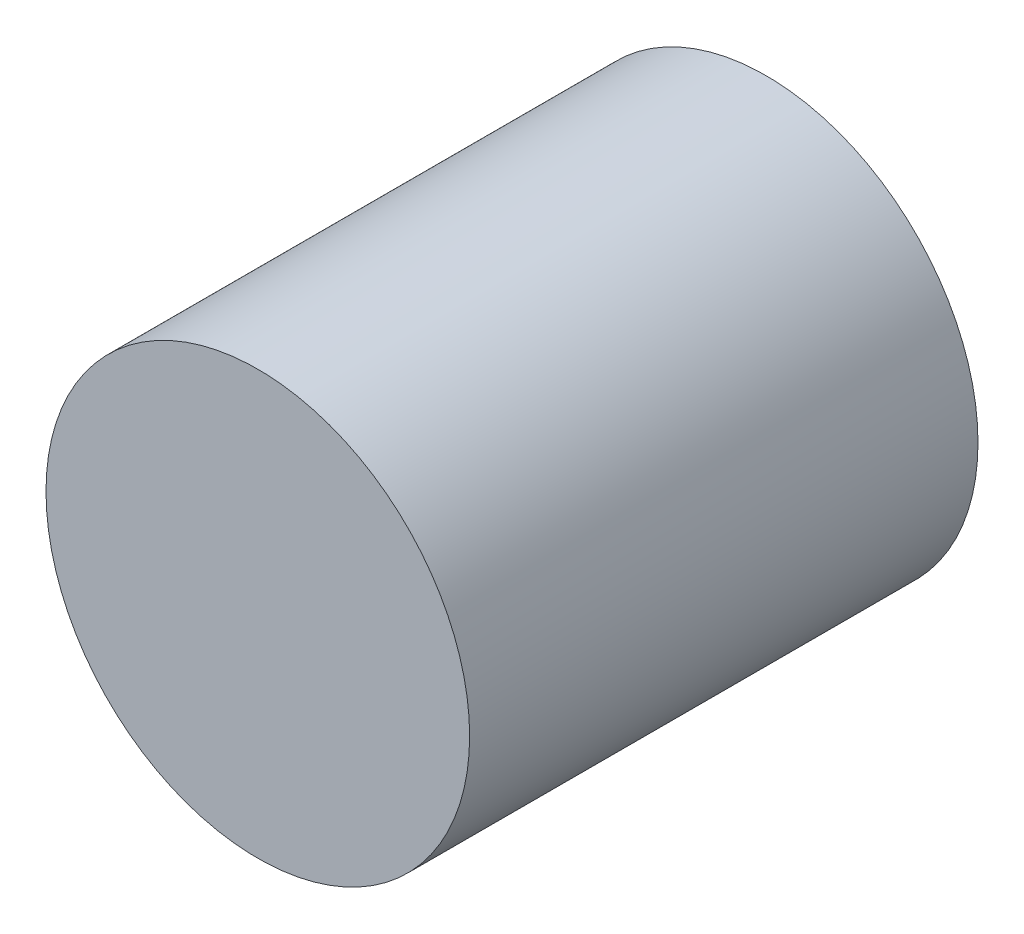
ISO-10303-21;
HEADER;
FILE_DESCRIPTION(('STEP AP214'),'2;1');
FILE_NAME('part.step','',(''),(''),'','','');
FILE_SCHEMA(('AUTOMOTIVE_DESIGN { 1 0 10303 214 1 1 1 1 }'));
ENDSEC;
DATA;
#1=APPLICATION_CONTEXT('core data for automotive mechanical design processes');
#2=APPLICATION_PROTOCOL_DEFINITION('international standard','automotive_design',2000,#1);
#3=PRODUCT_CONTEXT('',#1,'mechanical');
#4=PRODUCT('Part','Part','',(#3));
#5=PRODUCT_RELATED_PRODUCT_CATEGORY('part','',(#4));
#6=PRODUCT_DEFINITION_FORMATION('','',#4);
#7=PRODUCT_DEFINITION_CONTEXT('part definition',#1,'design');
#8=PRODUCT_DEFINITION('design','',#6,#7);
#9=PRODUCT_DEFINITION_SHAPE('','',#8);
#10=(LENGTH_UNIT() NAMED_UNIT(*) SI_UNIT(.MILLI.,.METRE.));
#11=(NAMED_UNIT(*) PLANE_ANGLE_UNIT() SI_UNIT($,.RADIAN.));
#12=(NAMED_UNIT(*) SI_UNIT($,.STERADIAN.) SOLID_ANGLE_UNIT());
#13=UNCERTAINTY_MEASURE_WITH_UNIT(LENGTH_MEASURE(1.E-05),#10,'distance_accuracy_value','');
#14=(GEOMETRIC_REPRESENTATION_CONTEXT(3) GLOBAL_UNCERTAINTY_ASSIGNED_CONTEXT((#13)) GLOBAL_UNIT_ASSIGNED_CONTEXT((#10,
#11,#12)) REPRESENTATION_CONTEXT('',''));
#15=CARTESIAN_POINT('',(0.,0.,0.));
#16=DIRECTION('',(0.,0.,1.));
#17=DIRECTION('',(1.,0.,0.));
#18=AXIS2_PLACEMENT_3D('',#15,#16,#17);
#19=CARTESIAN_POINT('',(1.00000054,0.,0.));
#20=DIRECTION('',(0.,0.,-1.));
#21=DIRECTION('',(-1.,0.,0.));
#22=AXIS2_PLACEMENT_3D('',#19,#20,#21);
#23=PLANE('',#22);
#24=CARTESIAN_POINT('',(0.,0.,0.));
#25=DIRECTION('',(0.,0.,-1.));
#26=DIRECTION('',(-1.,0.,0.));
#27=AXIS2_PLACEMENT_3D('',#24,#25,#26);
#28=CIRCLE('',#27,1.00000054);
#29=CARTESIAN_POINT('',(-1.00000054,0.,0.));
#30=VERTEX_POINT('',#29);
#31=EDGE_CURVE('E17',#30,#30,#28,.F.);
#32=ORIENTED_EDGE('',*,*,#31,.F.);
#33=EDGE_LOOP('',(#32));
#34=FACE_BOUND('',#33,.T.);
#35=ADVANCED_FACE('F14',(#34),#23,.T.);
#36=CARTESIAN_POINT('',(1.00000054,0.,2.40000028));
#37=DIRECTION('',(0.,0.,-1.));
#38=DIRECTION('',(-1.,0.,0.));
#39=AXIS2_PLACEMENT_3D('',#36,#37,#38);
#40=PLANE('',#39);
#41=CARTESIAN_POINT('',(0.,0.,2.40000028));
#42=DIRECTION('',(0.,0.,-1.));
#43=DIRECTION('',(-1.,0.,0.));
#44=AXIS2_PLACEMENT_3D('',#41,#42,#43);
#45=CIRCLE('',#44,1.00000054);
#46=CARTESIAN_POINT('',(-1.00000054,0.,2.40000028));
#47=VERTEX_POINT('',#46);
#48=EDGE_CURVE('E10',#47,#47,#45,.T.);
#49=ORIENTED_EDGE('',*,*,#48,.F.);
#50=EDGE_LOOP('',(#49));
#51=FACE_BOUND('',#50,.T.);
#52=ADVANCED_FACE('F29',(#51),#40,.F.);
#53=CARTESIAN_POINT('',(0.,0.,0.));
#54=DIRECTION('',(0.,0.,-1.));
#55=DIRECTION('',(-1.,0.,0.));
#56=AXIS2_PLACEMENT_3D('',#53,#54,#55);
#57=CYLINDRICAL_SURFACE('',#56,1.00000054);
#58=ORIENTED_EDGE('',*,*,#48,.T.);
#59=EDGE_LOOP('',(#58));
#60=FACE_BOUND('',#59,.T.);
#61=ORIENTED_EDGE('',*,*,#31,.T.);
#62=EDGE_LOOP('',(#61));
#63=FACE_BOUND('',#62,.T.);
#64=ADVANCED_FACE('F26',(#60,#63),#57,.T.);
#65=CLOSED_SHELL('',(#35,#52,#64));
#66=MANIFOLD_SOLID_BREP('B1',#65);
#67=ADVANCED_BREP_SHAPE_REPRESENTATION('',(#18,#66),#14);
#68=SHAPE_DEFINITION_REPRESENTATION(#9,#67);
ENDSEC;
END-ISO-10303-21;
